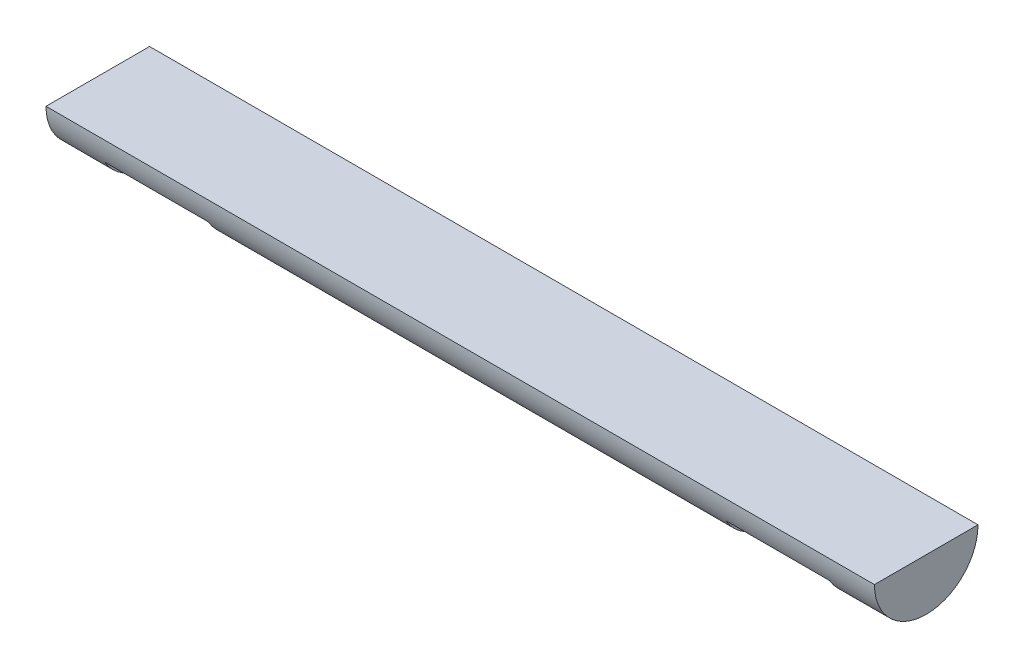
ISO-10303-21;
HEADER;
FILE_DESCRIPTION(('STEP AP214'),'2;1');
FILE_NAME('part.step','',(''),(''),'','','');
FILE_SCHEMA(('AUTOMOTIVE_DESIGN { 1 0 10303 214 1 1 1 1 }'));
ENDSEC;
DATA;
#1=APPLICATION_CONTEXT('core data for automotive mechanical design processes');
#2=APPLICATION_PROTOCOL_DEFINITION('international standard','automotive_design',2000,#1);
#3=PRODUCT_CONTEXT('',#1,'mechanical');
#4=PRODUCT('Part','Part','',(#3));
#5=PRODUCT_RELATED_PRODUCT_CATEGORY('part','',(#4));
#6=PRODUCT_DEFINITION_FORMATION('','',#4);
#7=PRODUCT_DEFINITION_CONTEXT('part definition',#1,'design');
#8=PRODUCT_DEFINITION('design','',#6,#7);
#9=PRODUCT_DEFINITION_SHAPE('','',#8);
#10=(LENGTH_UNIT() NAMED_UNIT(*) SI_UNIT(.MILLI.,.METRE.));
#11=(NAMED_UNIT(*) PLANE_ANGLE_UNIT() SI_UNIT($,.RADIAN.));
#12=(NAMED_UNIT(*) SI_UNIT($,.STERADIAN.) SOLID_ANGLE_UNIT());
#13=UNCERTAINTY_MEASURE_WITH_UNIT(LENGTH_MEASURE(1.E-05),#10,'distance_accuracy_value','');
#14=(GEOMETRIC_REPRESENTATION_CONTEXT(3) GLOBAL_UNCERTAINTY_ASSIGNED_CONTEXT((#13)) GLOBAL_UNIT_ASSIGNED_CONTEXT((#10,
#11,#12)) REPRESENTATION_CONTEXT('',''));
#15=CARTESIAN_POINT('',(0.,0.,0.));
#16=DIRECTION('',(0.,0.,1.));
#17=DIRECTION('',(1.,0.,0.));
#18=AXIS2_PLACEMENT_3D('',#15,#16,#17);
#19=CARTESIAN_POINT('',(2743.2,0.,0.));
#20=DIRECTION('',(-1.,0.,0.));
#21=DIRECTION('',(0.,0.,1.));
#22=AXIS2_PLACEMENT_3D('',#19,#20,#21);
#23=CYLINDRICAL_SURFACE('',#22,152.4);
#24=DIRECTION('',(-1.,0.,0.));
#25=VECTOR('',#24,1.);
#26=CARTESIAN_POINT('',(2743.2,-76.2,-131.982271536748));
#27=LINE('',#26,#25);
#28=CARTESIAN_POINT('',(609.6,-76.2,-131.982271536748));
#29=VERTEX_POINT('',#28);
#30=CARTESIAN_POINT('',(304.8,-76.2,-131.982271536748));
#31=VERTEX_POINT('',#30);
#32=EDGE_CURVE('E109',#29,#31,#27,.T.);
#33=ORIENTED_EDGE('',*,*,#32,.T.);
#34=CARTESIAN_POINT('',(304.8,0.,0.));
#35=DIRECTION('',(-1.,0.,0.));
#36=DIRECTION('',(0.,0.,1.));
#37=AXIS2_PLACEMENT_3D('',#34,#35,#36);
#38=CIRCLE('',#37,152.4);
#39=CARTESIAN_POINT('',(304.8,-76.2,131.982271536748));
#40=VERTEX_POINT('',#39);
#41=EDGE_CURVE('E112',#31,#40,#38,.T.);
#42=ORIENTED_EDGE('',*,*,#41,.T.);
#43=DIRECTION('',(-1.,0.,0.));
#44=VECTOR('',#43,1.);
#45=CARTESIAN_POINT('',(2743.2,-76.2,131.982271536748));
#46=LINE('',#45,#44);
#47=CARTESIAN_POINT('',(609.6,-76.2,131.982271536748));
#48=VERTEX_POINT('',#47);
#49=EDGE_CURVE('E106',#40,#48,#46,.F.);
#50=ORIENTED_EDGE('',*,*,#49,.T.);
#51=CARTESIAN_POINT('',(609.6,0.,0.));
#52=DIRECTION('',(1.,0.,0.));
#53=DIRECTION('',(0.,0.,-1.));
#54=AXIS2_PLACEMENT_3D('',#51,#52,#53);
#55=CIRCLE('',#54,152.4);
#56=EDGE_CURVE('E97',#48,#29,#55,.T.);
#57=ORIENTED_EDGE('',*,*,#56,.T.);
#58=EDGE_LOOP('',(#33,#42,#50,#57));
#59=FACE_BOUND('',#58,.T.);
#60=CARTESIAN_POINT('',(2133.6,0.,0.));
#61=DIRECTION('',(1.,0.,0.));
#62=DIRECTION('',(0.,0.,-1.));
#63=AXIS2_PLACEMENT_3D('',#60,#61,#62);
#64=CIRCLE('',#63,152.4);
#65=CARTESIAN_POINT('',(2133.6,-76.2,131.982271536748));
#66=VERTEX_POINT('',#65);
#67=CARTESIAN_POINT('',(2133.6,-76.2,-131.982271536748));
#68=VERTEX_POINT('',#67);
#69=EDGE_CURVE('E11',#66,#68,#64,.T.);
#70=ORIENTED_EDGE('',*,*,#69,.F.);
#71=DIRECTION('',(-1.,0.,0.));
#72=VECTOR('',#71,1.);
#73=CARTESIAN_POINT('',(2743.2,-76.2,131.982271536748));
#74=LINE('',#73,#72);
#75=CARTESIAN_POINT('',(2438.4,-76.2,131.982271536748));
#76=VERTEX_POINT('',#75);
#77=EDGE_CURVE('E41',#76,#66,#74,.T.);
#78=ORIENTED_EDGE('',*,*,#77,.F.);
#79=CARTESIAN_POINT('',(2438.4,0.,0.));
#80=DIRECTION('',(-1.,0.,0.));
#81=DIRECTION('',(0.,0.,1.));
#82=AXIS2_PLACEMENT_3D('',#79,#80,#81);
#83=CIRCLE('',#82,152.4);
#84=CARTESIAN_POINT('',(2438.4,-76.2,-131.982271536748));
#85=VERTEX_POINT('',#84);
#86=EDGE_CURVE('E115',#85,#76,#83,.T.);
#87=ORIENTED_EDGE('',*,*,#86,.F.);
#88=DIRECTION('',(-1.,0.,0.));
#89=VECTOR('',#88,1.);
#90=CARTESIAN_POINT('',(2743.2,-76.2,-131.982271536748));
#91=LINE('',#90,#89);
#92=EDGE_CURVE('E117',#68,#85,#91,.F.);
#93=ORIENTED_EDGE('',*,*,#92,.F.);
#94=EDGE_LOOP('',(#70,#78,#87,#93));
#95=FACE_BOUND('',#94,.T.);
#96=CARTESIAN_POINT('',(2590.8,0.,0.));
#97=DIRECTION('',(-1.,0.,0.));
#98=DIRECTION('',(0.,0.,1.));
#99=AXIS2_PLACEMENT_3D('',#96,#97,#98);
#100=CIRCLE('',#99,152.4);
#101=CARTESIAN_POINT('',(2590.8,0.,-152.4));
#102=VERTEX_POINT('',#101);
#103=CARTESIAN_POINT('',(2590.8,0.,152.4));
#104=VERTEX_POINT('',#103);
#105=EDGE_CURVE('E47',#102,#104,#100,.T.);
#106=ORIENTED_EDGE('',*,*,#105,.T.);
#107=DIRECTION('',(-1.,0.,0.));
#108=VECTOR('',#107,1.);
#109=CARTESIAN_POINT('',(2743.2,0.,152.4));
#110=LINE('',#109,#108);
#111=CARTESIAN_POINT('',(152.4,0.,152.4));
#112=VERTEX_POINT('',#111);
#113=EDGE_CURVE('E54',#104,#112,#110,.T.);
#114=ORIENTED_EDGE('',*,*,#113,.T.);
#115=CARTESIAN_POINT('',(152.4,0.,0.));
#116=DIRECTION('',(-1.,0.,0.));
#117=DIRECTION('',(0.,0.,1.));
#118=AXIS2_PLACEMENT_3D('',#115,#116,#117);
#119=CIRCLE('',#118,152.4);
#120=CARTESIAN_POINT('',(152.4,0.,-152.4));
#121=VERTEX_POINT('',#120);
#122=EDGE_CURVE('E87',#121,#112,#119,.T.);
#123=ORIENTED_EDGE('',*,*,#122,.F.);
#124=DIRECTION('',(-1.,0.,0.));
#125=VECTOR('',#124,1.);
#126=CARTESIAN_POINT('',(2743.2,0.,-152.4));
#127=LINE('',#126,#125);
#128=EDGE_CURVE('E89',#102,#121,#127,.T.);
#129=ORIENTED_EDGE('',*,*,#128,.F.);
#130=EDGE_LOOP('',(#106,#114,#123,#129));
#131=FACE_BOUND('',#130,.T.);
#132=ADVANCED_FACE('F34',(#59,#95,#131),#23,.T.);
#133=CARTESIAN_POINT('',(2743.2,0.,-152.4));
#134=DIRECTION('',(0.,-1.,0.));
#135=DIRECTION('',(0.,0.,-1.));
#136=AXIS2_PLACEMENT_3D('',#133,#134,#135);
#137=PLANE('',#136);
#138=DIRECTION('',(0.,0.,-1.));
#139=VECTOR('',#138,1.);
#140=CARTESIAN_POINT('',(2590.8,0.,152.4));
#141=LINE('',#140,#139);
#142=EDGE_CURVE('E83',#104,#102,#141,.T.);
#143=ORIENTED_EDGE('',*,*,#142,.T.);
#144=ORIENTED_EDGE('',*,*,#128,.T.);
#145=DIRECTION('',(0.,0.,-1.));
#146=VECTOR('',#145,1.);
#147=CARTESIAN_POINT('',(152.4,0.,152.4));
#148=LINE('',#147,#146);
#149=EDGE_CURVE('E94',#112,#121,#148,.T.);
#150=ORIENTED_EDGE('',*,*,#149,.F.);
#151=ORIENTED_EDGE('',*,*,#113,.F.);
#152=EDGE_LOOP('',(#143,#144,#150,#151));
#153=FACE_BOUND('',#152,.T.);
#154=ADVANCED_FACE('F92',(#153),#137,.F.);
#155=CARTESIAN_POINT('',(304.8,-152.4,-152.4));
#156=DIRECTION('',(-1.,0.,0.));
#157=DIRECTION('',(0.,0.,1.));
#158=AXIS2_PLACEMENT_3D('',#155,#156,#157);
#159=PLANE('',#158);
#160=DIRECTION('',(0.,0.,1.));
#161=VECTOR('',#160,1.);
#162=CARTESIAN_POINT('',(304.8,-76.2,-152.4));
#163=LINE('',#162,#161);
#164=EDGE_CURVE('E95',#31,#40,#163,.T.);
#165=ORIENTED_EDGE('',*,*,#164,.T.);
#166=ORIENTED_EDGE('',*,*,#41,.F.);
#167=EDGE_LOOP('',(#165,#166));
#168=FACE_BOUND('',#167,.T.);
#169=ADVANCED_FACE('F156',(#168),#159,.F.);
#170=CARTESIAN_POINT('',(304.8,-76.2,-152.4));
#171=DIRECTION('',(0.,1.,0.));
#172=DIRECTION('',(0.,0.,1.));
#173=AXIS2_PLACEMENT_3D('',#170,#171,#172);
#174=PLANE('',#173);
#175=DIRECTION('',(0.,0.,1.));
#176=VECTOR('',#175,1.);
#177=CARTESIAN_POINT('',(609.6,-76.2,-152.4));
#178=LINE('',#177,#176);
#179=EDGE_CURVE('E100',#29,#48,#178,.T.);
#180=ORIENTED_EDGE('',*,*,#179,.T.);
#181=ORIENTED_EDGE('',*,*,#49,.F.);
#182=ORIENTED_EDGE('',*,*,#164,.F.);
#183=ORIENTED_EDGE('',*,*,#32,.F.);
#184=EDGE_LOOP('',(#180,#181,#182,#183));
#185=FACE_BOUND('',#184,.T.);
#186=ADVANCED_FACE('F160',(#185),#174,.F.);
#187=CARTESIAN_POINT('',(609.6,-76.2,-152.4));
#188=DIRECTION('',(1.,0.,0.));
#189=DIRECTION('',(0.,0.,-1.));
#190=AXIS2_PLACEMENT_3D('',#187,#188,#189);
#191=PLANE('',#190);
#192=ORIENTED_EDGE('',*,*,#179,.F.);
#193=ORIENTED_EDGE('',*,*,#56,.F.);
#194=EDGE_LOOP('',(#192,#193));
#195=FACE_BOUND('',#194,.T.);
#196=ADVANCED_FACE('F167',(#195),#191,.F.);
#197=CARTESIAN_POINT('',(2133.6,-76.2,-152.4));
#198=DIRECTION('',(1.,0.,0.));
#199=DIRECTION('',(0.,0.,-1.));
#200=AXIS2_PLACEMENT_3D('',#197,#198,#199);
#201=PLANE('',#200);
#202=DIRECTION('',(0.,0.,1.));
#203=VECTOR('',#202,1.);
#204=CARTESIAN_POINT('',(2133.6,-76.2,-152.4));
#205=LINE('',#204,#203);
#206=EDGE_CURVE('E126',#68,#66,#205,.T.);
#207=ORIENTED_EDGE('',*,*,#206,.T.);
#208=ORIENTED_EDGE('',*,*,#69,.T.);
#209=EDGE_LOOP('',(#207,#208));
#210=FACE_BOUND('',#209,.T.);
#211=ADVANCED_FACE('F132',(#210),#201,.T.);
#212=CARTESIAN_POINT('',(2438.4,-76.2,-152.4));
#213=DIRECTION('',(0.,-1.,0.));
#214=DIRECTION('',(0.,0.,-1.));
#215=AXIS2_PLACEMENT_3D('',#212,#213,#214);
#216=PLANE('',#215);
#217=ORIENTED_EDGE('',*,*,#77,.T.);
#218=ORIENTED_EDGE('',*,*,#206,.F.);
#219=ORIENTED_EDGE('',*,*,#92,.T.);
#220=DIRECTION('',(0.,0.,1.));
#221=VECTOR('',#220,1.);
#222=CARTESIAN_POINT('',(2438.4,-76.2,-152.4));
#223=LINE('',#222,#221);
#224=EDGE_CURVE('E129',#85,#76,#223,.T.);
#225=ORIENTED_EDGE('',*,*,#224,.T.);
#226=EDGE_LOOP('',(#217,#218,#219,#225));
#227=FACE_BOUND('',#226,.T.);
#228=ADVANCED_FACE('F125',(#227),#216,.T.);
#229=CARTESIAN_POINT('',(2438.4,-152.4,-152.4));
#230=DIRECTION('',(-1.,0.,0.));
#231=DIRECTION('',(0.,0.,1.));
#232=AXIS2_PLACEMENT_3D('',#229,#230,#231);
#233=PLANE('',#232);
#234=ORIENTED_EDGE('',*,*,#224,.F.);
#235=ORIENTED_EDGE('',*,*,#86,.T.);
#236=EDGE_LOOP('',(#234,#235));
#237=FACE_BOUND('',#236,.T.);
#238=ADVANCED_FACE('F141',(#237),#233,.T.);
#239=CARTESIAN_POINT('',(152.4,0.,0.));
#240=DIRECTION('',(-1.,0.,0.));
#241=DIRECTION('',(0.,0.,1.));
#242=AXIS2_PLACEMENT_3D('',#239,#240,#241);
#243=PLANE('',#242);
#244=ORIENTED_EDGE('',*,*,#122,.T.);
#245=ORIENTED_EDGE('',*,*,#149,.T.);
#246=EDGE_LOOP('',(#244,#245));
#247=FACE_BOUND('',#246,.T.);
#248=ADVANCED_FACE('F139',(#247),#243,.T.);
#249=CARTESIAN_POINT('',(2590.8,0.,0.));
#250=DIRECTION('',(1.,0.,0.));
#251=DIRECTION('',(0.,0.,1.));
#252=AXIS2_PLACEMENT_3D('',#249,#250,#251);
#253=PLANE('',#252);
#254=ORIENTED_EDGE('',*,*,#105,.F.);
#255=ORIENTED_EDGE('',*,*,#142,.F.);
#256=EDGE_LOOP('',(#254,#255));
#257=FACE_BOUND('',#256,.T.);
#258=ADVANCED_FACE('F84',(#257),#253,.T.);
#259=CLOSED_SHELL('',(#132,#154,#169,#186,#196,#211,#228,#238,#248,#258));
#260=MANIFOLD_SOLID_BREP('B2',#259);
#261=ADVANCED_BREP_SHAPE_REPRESENTATION('',(#18,#260),#14);
#262=SHAPE_DEFINITION_REPRESENTATION(#9,#261);
ENDSEC;
END-ISO-10303-21;
